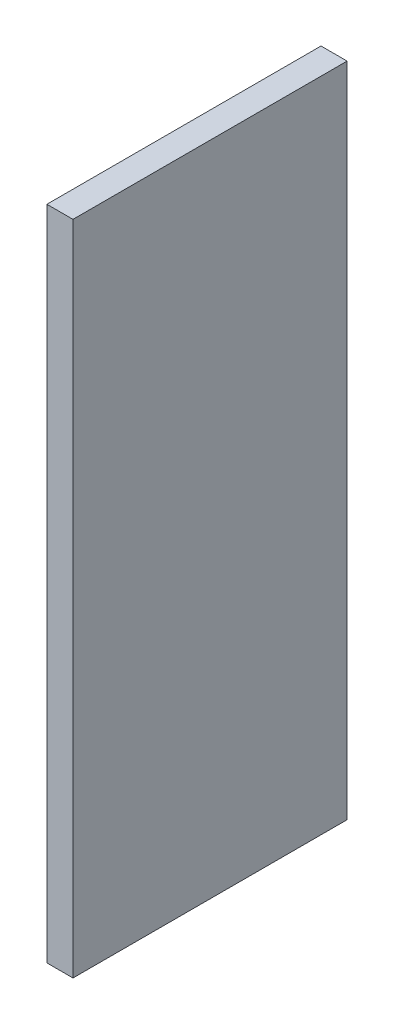
ISO-10303-21;
HEADER;
FILE_DESCRIPTION(('STEP AP214'),'2;1');
FILE_NAME('part.step','',(''),(''),'','','');
FILE_SCHEMA(('AUTOMOTIVE_DESIGN { 1 0 10303 214 1 1 1 1 }'));
ENDSEC;
DATA;
#1=APPLICATION_CONTEXT('core data for automotive mechanical design processes');
#2=APPLICATION_PROTOCOL_DEFINITION('international standard','automotive_design',2000,#1);
#3=PRODUCT_CONTEXT('',#1,'mechanical');
#4=PRODUCT('Part','Part','',(#3));
#5=PRODUCT_RELATED_PRODUCT_CATEGORY('part','',(#4));
#6=PRODUCT_DEFINITION_FORMATION('','',#4);
#7=PRODUCT_DEFINITION_CONTEXT('part definition',#1,'design');
#8=PRODUCT_DEFINITION('design','',#6,#7);
#9=PRODUCT_DEFINITION_SHAPE('','',#8);
#10=(LENGTH_UNIT() NAMED_UNIT(*) SI_UNIT(.MILLI.,.METRE.));
#11=(NAMED_UNIT(*) PLANE_ANGLE_UNIT() SI_UNIT($,.RADIAN.));
#12=(NAMED_UNIT(*) SI_UNIT($,.STERADIAN.) SOLID_ANGLE_UNIT());
#13=UNCERTAINTY_MEASURE_WITH_UNIT(LENGTH_MEASURE(1.E-05),#10,'distance_accuracy_value','');
#14=(GEOMETRIC_REPRESENTATION_CONTEXT(3) GLOBAL_UNCERTAINTY_ASSIGNED_CONTEXT((#13)) GLOBAL_UNIT_ASSIGNED_CONTEXT((#10,
#11,#12)) REPRESENTATION_CONTEXT('',''));
#15=CARTESIAN_POINT('',(0.,0.,0.));
#16=DIRECTION('',(0.,0.,1.));
#17=DIRECTION('',(1.,0.,0.));
#18=AXIS2_PLACEMENT_3D('',#15,#16,#17);
#19=CARTESIAN_POINT('',(0.,0.,31.5));
#20=DIRECTION('',(1.,0.,0.));
#21=DIRECTION('',(0.,0.,-1.));
#22=AXIS2_PLACEMENT_3D('',#19,#20,#21);
#23=PLANE('',#22);
#24=DIRECTION('',(0.,-1.,0.));
#25=VECTOR('',#24,1.);
#26=CARTESIAN_POINT('',(0.,0.,0.));
#27=LINE('',#26,#25);
#28=CARTESIAN_POINT('',(0.,75.5,0.));
#29=VERTEX_POINT('',#28);
#30=CARTESIAN_POINT('',(0.,0.,0.));
#31=VERTEX_POINT('',#30);
#32=EDGE_CURVE('E84',#29,#31,#27,.T.);
#33=ORIENTED_EDGE('',*,*,#32,.T.);
#34=DIRECTION('',(0.,0.,-1.));
#35=VECTOR('',#34,1.);
#36=CARTESIAN_POINT('',(0.,0.,31.5));
#37=LINE('',#36,#35);
#38=CARTESIAN_POINT('',(0.,0.,31.5));
#39=VERTEX_POINT('',#38);
#40=EDGE_CURVE('E11',#39,#31,#37,.T.);
#41=ORIENTED_EDGE('',*,*,#40,.F.);
#42=DIRECTION('',(0.,-1.,0.));
#43=VECTOR('',#42,1.);
#44=CARTESIAN_POINT('',(0.,0.,31.5));
#45=LINE('',#44,#43);
#46=CARTESIAN_POINT('',(0.,75.5,31.5));
#47=VERTEX_POINT('',#46);
#48=EDGE_CURVE('E75',#47,#39,#45,.T.);
#49=ORIENTED_EDGE('',*,*,#48,.F.);
#50=DIRECTION('',(0.,0.,-1.));
#51=VECTOR('',#50,1.);
#52=CARTESIAN_POINT('',(0.,75.5,31.5));
#53=LINE('',#52,#51);
#54=EDGE_CURVE('E95',#47,#29,#53,.T.);
#55=ORIENTED_EDGE('',*,*,#54,.T.);
#56=EDGE_LOOP('',(#33,#41,#49,#55));
#57=FACE_BOUND('',#56,.T.);
#58=ADVANCED_FACE('F41',(#57),#23,.F.);
#59=CARTESIAN_POINT('',(0.,0.,31.5));
#60=DIRECTION('',(0.,1.,0.));
#61=DIRECTION('',(0.,0.,1.));
#62=AXIS2_PLACEMENT_3D('',#59,#60,#61);
#63=PLANE('',#62);
#64=DIRECTION('',(1.,0.,0.));
#65=VECTOR('',#64,1.);
#66=CARTESIAN_POINT('',(0.,0.,0.));
#67=LINE('',#66,#65);
#68=CARTESIAN_POINT('',(3.,0.,0.));
#69=VERTEX_POINT('',#68);
#70=EDGE_CURVE('E68',#31,#69,#67,.T.);
#71=ORIENTED_EDGE('',*,*,#70,.T.);
#72=DIRECTION('',(0.,0.,-1.));
#73=VECTOR('',#72,1.);
#74=CARTESIAN_POINT('',(3.,0.,31.5));
#75=LINE('',#74,#73);
#76=CARTESIAN_POINT('',(3.,0.,31.5));
#77=VERTEX_POINT('',#76);
#78=EDGE_CURVE('E49',#77,#69,#75,.T.);
#79=ORIENTED_EDGE('',*,*,#78,.F.);
#80=DIRECTION('',(1.,0.,0.));
#81=VECTOR('',#80,1.);
#82=CARTESIAN_POINT('',(0.,0.,31.5));
#83=LINE('',#82,#81);
#84=EDGE_CURVE('E57',#39,#77,#83,.T.);
#85=ORIENTED_EDGE('',*,*,#84,.F.);
#86=ORIENTED_EDGE('',*,*,#40,.T.);
#87=EDGE_LOOP('',(#71,#79,#85,#86));
#88=FACE_BOUND('',#87,.T.);
#89=ADVANCED_FACE('F114',(#88),#63,.F.);
#90=CARTESIAN_POINT('',(3.,0.,31.5));
#91=DIRECTION('',(-1.,0.,0.));
#92=DIRECTION('',(0.,0.,1.));
#93=AXIS2_PLACEMENT_3D('',#90,#91,#92);
#94=PLANE('',#93);
#95=DIRECTION('',(0.,1.,0.));
#96=VECTOR('',#95,1.);
#97=CARTESIAN_POINT('',(3.,0.,0.));
#98=LINE('',#97,#96);
#99=CARTESIAN_POINT('',(3.,75.5,0.));
#100=VERTEX_POINT('',#99);
#101=EDGE_CURVE('E104',#69,#100,#98,.T.);
#102=ORIENTED_EDGE('',*,*,#101,.T.);
#103=DIRECTION('',(0.,0.,-1.));
#104=VECTOR('',#103,1.);
#105=CARTESIAN_POINT('',(3.,75.5,31.5));
#106=LINE('',#105,#104);
#107=CARTESIAN_POINT('',(3.,75.5,31.5));
#108=VERTEX_POINT('',#107);
#109=EDGE_CURVE('E88',#108,#100,#106,.T.);
#110=ORIENTED_EDGE('',*,*,#109,.F.);
#111=DIRECTION('',(0.,1.,0.));
#112=VECTOR('',#111,1.);
#113=CARTESIAN_POINT('',(3.,0.,31.5));
#114=LINE('',#113,#112);
#115=EDGE_CURVE('E106',#77,#108,#114,.T.);
#116=ORIENTED_EDGE('',*,*,#115,.F.);
#117=ORIENTED_EDGE('',*,*,#78,.T.);
#118=EDGE_LOOP('',(#102,#110,#116,#117));
#119=FACE_BOUND('',#118,.T.);
#120=ADVANCED_FACE('F112',(#119),#94,.F.);
#121=CARTESIAN_POINT('',(0.,0.,31.5));
#122=DIRECTION('',(0.,0.,-1.));
#123=DIRECTION('',(-1.,0.,0.));
#124=AXIS2_PLACEMENT_3D('',#121,#122,#123);
#125=PLANE('',#124);
#126=ORIENTED_EDGE('',*,*,#48,.T.);
#127=ORIENTED_EDGE('',*,*,#84,.T.);
#128=ORIENTED_EDGE('',*,*,#115,.T.);
#129=DIRECTION('',(-1.,0.,0.));
#130=VECTOR('',#129,1.);
#131=CARTESIAN_POINT('',(0.,75.5,31.5));
#132=LINE('',#131,#130);
#133=EDGE_CURVE('E97',#108,#47,#132,.T.);
#134=ORIENTED_EDGE('',*,*,#133,.T.);
#135=EDGE_LOOP('',(#126,#127,#128,#134));
#136=FACE_BOUND('',#135,.T.);
#137=ADVANCED_FACE('F115',(#136),#125,.F.);
#138=CARTESIAN_POINT('',(0.,0.,0.));
#139=DIRECTION('',(0.,0.,-1.));
#140=DIRECTION('',(-1.,0.,0.));
#141=AXIS2_PLACEMENT_3D('',#138,#139,#140);
#142=PLANE('',#141);
#143=ORIENTED_EDGE('',*,*,#32,.F.);
#144=DIRECTION('',(-1.,0.,0.));
#145=VECTOR('',#144,1.);
#146=CARTESIAN_POINT('',(0.,75.5,0.));
#147=LINE('',#146,#145);
#148=EDGE_CURVE('E87',#100,#29,#147,.T.);
#149=ORIENTED_EDGE('',*,*,#148,.F.);
#150=ORIENTED_EDGE('',*,*,#101,.F.);
#151=ORIENTED_EDGE('',*,*,#70,.F.);
#152=EDGE_LOOP('',(#143,#149,#150,#151));
#153=FACE_BOUND('',#152,.T.);
#154=ADVANCED_FACE('F86',(#153),#142,.T.);
#155=CARTESIAN_POINT('',(0.,75.5,31.5));
#156=DIRECTION('',(0.,-1.,0.));
#157=DIRECTION('',(0.,0.,-1.));
#158=AXIS2_PLACEMENT_3D('',#155,#156,#157);
#159=PLANE('',#158);
#160=ORIENTED_EDGE('',*,*,#148,.T.);
#161=ORIENTED_EDGE('',*,*,#54,.F.);
#162=ORIENTED_EDGE('',*,*,#133,.F.);
#163=ORIENTED_EDGE('',*,*,#109,.T.);
#164=EDGE_LOOP('',(#160,#161,#162,#163));
#165=FACE_BOUND('',#164,.T.);
#166=ADVANCED_FACE('F93',(#165),#159,.F.);
#167=CLOSED_SHELL('',(#58,#89,#120,#137,#154,#166));
#168=MANIFOLD_SOLID_BREP('B2',#167);
#169=ADVANCED_BREP_SHAPE_REPRESENTATION('',(#18,#168),#14);
#170=SHAPE_DEFINITION_REPRESENTATION(#9,#169);
ENDSEC;
END-ISO-10303-21;
